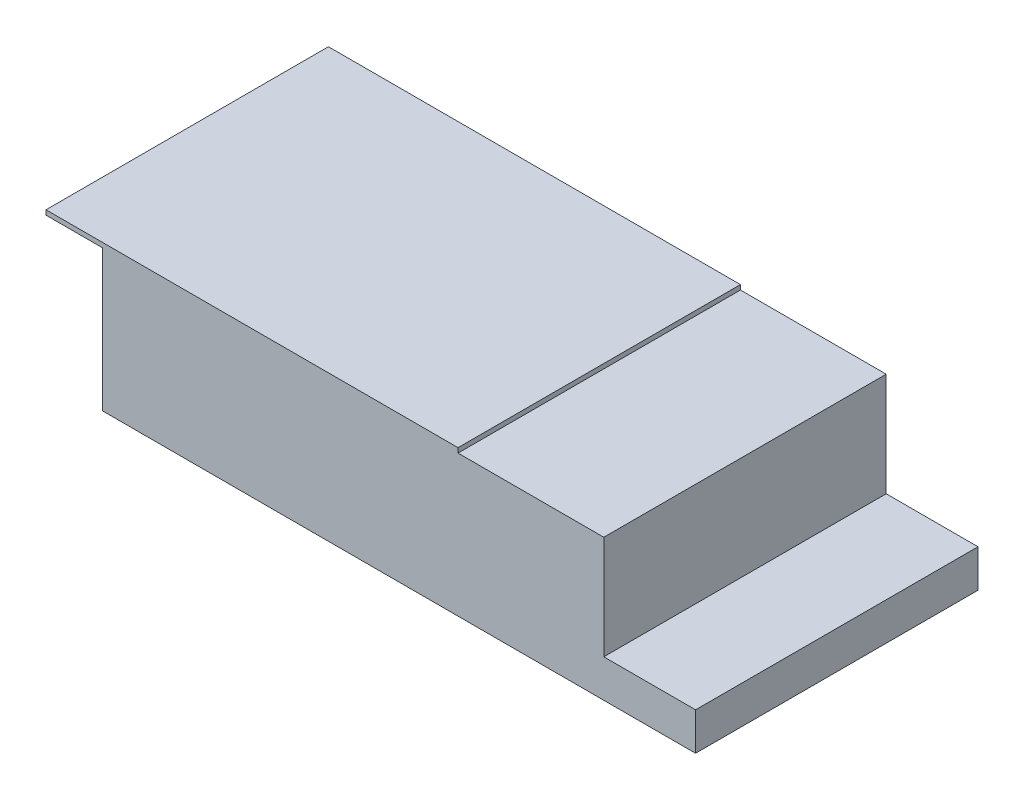
ISO-10303-21;
HEADER;
FILE_DESCRIPTION(('STEP AP214'),'2;1');
FILE_NAME('part.step','',(''),(''),'','','');
FILE_SCHEMA(('AUTOMOTIVE_DESIGN { 1 0 10303 214 1 1 1 1 }'));
ENDSEC;
DATA;
#1=APPLICATION_CONTEXT('core data for automotive mechanical design processes');
#2=APPLICATION_PROTOCOL_DEFINITION('international standard','automotive_design',2000,#1);
#3=PRODUCT_CONTEXT('',#1,'mechanical');
#4=PRODUCT('Part','Part','',(#3));
#5=PRODUCT_RELATED_PRODUCT_CATEGORY('part','',(#4));
#6=PRODUCT_DEFINITION_FORMATION('','',#4);
#7=PRODUCT_DEFINITION_CONTEXT('part definition',#1,'design');
#8=PRODUCT_DEFINITION('design','',#6,#7);
#9=PRODUCT_DEFINITION_SHAPE('','',#8);
#10=(LENGTH_UNIT() NAMED_UNIT(*) SI_UNIT(.MILLI.,.METRE.));
#11=(NAMED_UNIT(*) PLANE_ANGLE_UNIT() SI_UNIT($,.RADIAN.));
#12=(NAMED_UNIT(*) SI_UNIT($,.STERADIAN.) SOLID_ANGLE_UNIT());
#13=UNCERTAINTY_MEASURE_WITH_UNIT(LENGTH_MEASURE(1.E-05),#10,'distance_accuracy_value','');
#14=(GEOMETRIC_REPRESENTATION_CONTEXT(3) GLOBAL_UNCERTAINTY_ASSIGNED_CONTEXT((#13)) GLOBAL_UNIT_ASSIGNED_CONTEXT((#10,
#11,#12)) REPRESENTATION_CONTEXT('',''));
#15=CARTESIAN_POINT('',(0.,0.,0.));
#16=DIRECTION('',(0.,0.,1.));
#17=DIRECTION('',(1.,0.,0.));
#18=AXIS2_PLACEMENT_3D('',#15,#16,#17);
#19=CARTESIAN_POINT('',(0.,30.,0.));
#20=DIRECTION('',(0.,-1.,0.));
#21=DIRECTION('',(0.,0.,-1.));
#22=AXIS2_PLACEMENT_3D('',#19,#20,#21);
#23=PLANE('',#22);
#24=DIRECTION('',(0.,0.,-1.));
#25=VECTOR('',#24,1.);
#26=CARTESIAN_POINT('',(12.5332814769224,30.,-30.));
#27=LINE('',#26,#25);
#28=CARTESIAN_POINT('',(12.5332814769224,30.,29.9999999999999));
#29=VERTEX_POINT('',#28);
#30=CARTESIAN_POINT('',(12.5332814769224,30.,-30.));
#31=VERTEX_POINT('',#30);
#32=EDGE_CURVE('E61',#29,#31,#27,.T.);
#33=ORIENTED_EDGE('',*,*,#32,.F.);
#34=DIRECTION('',(1.,0.,0.));
#35=VECTOR('',#34,1.);
#36=CARTESIAN_POINT('',(-63.0000000000001,30.,29.9999999999999));
#37=LINE('',#36,#35);
#38=CARTESIAN_POINT('',(43.5,30.,29.9999999999999));
#39=VERTEX_POINT('',#38);
#40=EDGE_CURVE('E189',#29,#39,#37,.T.);
#41=ORIENTED_EDGE('',*,*,#40,.T.);
#42=DIRECTION('',(0.,0.,1.));
#43=VECTOR('',#42,1.);
#44=CARTESIAN_POINT('',(43.5,30.,-30.));
#45=LINE('',#44,#43);
#46=CARTESIAN_POINT('',(43.5,30.,-30.));
#47=VERTEX_POINT('',#46);
#48=EDGE_CURVE('E151',#47,#39,#45,.T.);
#49=ORIENTED_EDGE('',*,*,#48,.F.);
#50=DIRECTION('',(-1.,0.,0.));
#51=VECTOR('',#50,1.);
#52=CARTESIAN_POINT('',(-63.0000000000001,30.,-30.));
#53=LINE('',#52,#51);
#54=EDGE_CURVE('E181',#47,#31,#53,.T.);
#55=ORIENTED_EDGE('',*,*,#54,.T.);
#56=EDGE_LOOP('',(#33,#41,#49,#55));
#57=FACE_BOUND('',#56,.T.);
#58=ADVANCED_FACE('F45',(#57),#23,.F.);
#59=CARTESIAN_POINT('',(63.0000000000001,30.,29.9999999999999));
#60=DIRECTION('',(-1.,0.,0.));
#61=DIRECTION('',(0.,0.,1.));
#62=AXIS2_PLACEMENT_3D('',#59,#60,#61);
#63=PLANE('',#62);
#64=DIRECTION('',(0.,0.,-1.));
#65=VECTOR('',#64,1.);
#66=CARTESIAN_POINT('',(63.0000000000001,8.,29.9999999999999));
#67=LINE('',#66,#65);
#68=CARTESIAN_POINT('',(63.0000000000001,8.,29.9999999999999));
#69=VERTEX_POINT('',#68);
#70=CARTESIAN_POINT('',(63.0000000000001,8.,-30.));
#71=VERTEX_POINT('',#70);
#72=EDGE_CURVE('E171',#69,#71,#67,.T.);
#73=ORIENTED_EDGE('',*,*,#72,.F.);
#74=DIRECTION('',(0.,-1.,0.));
#75=VECTOR('',#74,1.);
#76=CARTESIAN_POINT('',(63.0000000000001,30.,29.9999999999999));
#77=LINE('',#76,#75);
#78=CARTESIAN_POINT('',(63.0000000000001,0.,29.9999999999999));
#79=VERTEX_POINT('',#78);
#80=EDGE_CURVE('E192',#69,#79,#77,.T.);
#81=ORIENTED_EDGE('',*,*,#80,.T.);
#82=DIRECTION('',(0.,0.,-1.));
#83=VECTOR('',#82,1.);
#84=CARTESIAN_POINT('',(63.0000000000001,0.,29.9999999999999));
#85=LINE('',#84,#83);
#86=CARTESIAN_POINT('',(63.0000000000001,0.,-30.));
#87=VERTEX_POINT('',#86);
#88=EDGE_CURVE('E178',#79,#87,#85,.T.);
#89=ORIENTED_EDGE('',*,*,#88,.T.);
#90=DIRECTION('',(0.,-1.,0.));
#91=VECTOR('',#90,1.);
#92=CARTESIAN_POINT('',(63.0000000000001,30.,-30.));
#93=LINE('',#92,#91);
#94=EDGE_CURVE('E11',#71,#87,#93,.T.);
#95=ORIENTED_EDGE('',*,*,#94,.F.);
#96=EDGE_LOOP('',(#73,#81,#89,#95));
#97=FACE_BOUND('',#96,.T.);
#98=ADVANCED_FACE('F47',(#97),#63,.F.);
#99=CARTESIAN_POINT('',(-63.0000000000001,30.,-30.));
#100=DIRECTION('',(0.,0.,1.));
#101=DIRECTION('',(1.,0.,0.));
#102=AXIS2_PLACEMENT_3D('',#99,#100,#101);
#103=PLANE('',#102);
#104=ORIENTED_EDGE('',*,*,#54,.F.);
#105=DIRECTION('',(0.,1.,0.));
#106=VECTOR('',#105,1.);
#107=CARTESIAN_POINT('',(43.5,8.,-30.));
#108=LINE('',#107,#106);
#109=CARTESIAN_POINT('',(43.5,8.,-30.));
#110=VERTEX_POINT('',#109);
#111=EDGE_CURVE('E69',#110,#47,#108,.T.);
#112=ORIENTED_EDGE('',*,*,#111,.F.);
#113=DIRECTION('',(-1.,0.,0.));
#114=VECTOR('',#113,1.);
#115=CARTESIAN_POINT('',(63.0000000000001,8.,-30.));
#116=LINE('',#115,#114);
#117=EDGE_CURVE('E155',#71,#110,#116,.T.);
#118=ORIENTED_EDGE('',*,*,#117,.F.);
#119=ORIENTED_EDGE('',*,*,#94,.T.);
#120=DIRECTION('',(-1.,0.,0.));
#121=VECTOR('',#120,1.);
#122=CARTESIAN_POINT('',(-63.0000000000001,0.,-30.));
#123=LINE('',#122,#121);
#124=CARTESIAN_POINT('',(-63.0000000000001,0.,-30.));
#125=VERTEX_POINT('',#124);
#126=EDGE_CURVE('E196',#87,#125,#123,.T.);
#127=ORIENTED_EDGE('',*,*,#126,.T.);
#128=DIRECTION('',(0.,-1.,0.));
#129=VECTOR('',#128,1.);
#130=CARTESIAN_POINT('',(-63.0000000000001,30.,-30.));
#131=LINE('',#130,#129);
#132=CARTESIAN_POINT('',(-63.0000000000001,30.,-30.));
#133=VERTEX_POINT('',#132);
#134=EDGE_CURVE('E54',#133,#125,#131,.T.);
#135=ORIENTED_EDGE('',*,*,#134,.F.);
#136=DIRECTION('',(-1.,0.,0.));
#137=VECTOR('',#136,1.);
#138=CARTESIAN_POINT('',(-75.0000000000001,30.,-30.));
#139=LINE('',#138,#137);
#140=CARTESIAN_POINT('',(-75.0000000000001,30.,-30.));
#141=VERTEX_POINT('',#140);
#142=EDGE_CURVE('E148',#133,#141,#139,.T.);
#143=ORIENTED_EDGE('',*,*,#142,.T.);
#144=DIRECTION('',(0.,-1.,0.));
#145=VECTOR('',#144,1.);
#146=CARTESIAN_POINT('',(-75.0000000000001,31.,-30.));
#147=LINE('',#146,#145);
#148=CARTESIAN_POINT('',(-75.0000000000001,31.,-30.));
#149=VERTEX_POINT('',#148);
#150=EDGE_CURVE('E127',#149,#141,#147,.T.);
#151=ORIENTED_EDGE('',*,*,#150,.F.);
#152=DIRECTION('',(-1.,0.,0.));
#153=VECTOR('',#152,1.);
#154=CARTESIAN_POINT('',(-75.0000000000001,31.,-30.));
#155=LINE('',#154,#153);
#156=CARTESIAN_POINT('',(12.5332814769224,31.,-30.));
#157=VERTEX_POINT('',#156);
#158=EDGE_CURVE('E134',#157,#149,#155,.T.);
#159=ORIENTED_EDGE('',*,*,#158,.F.);
#160=DIRECTION('',(0.,-1.,0.));
#161=VECTOR('',#160,1.);
#162=CARTESIAN_POINT('',(12.5332814769224,31.,-30.));
#163=LINE('',#162,#161);
#164=EDGE_CURVE('E242',#157,#31,#163,.T.);
#165=ORIENTED_EDGE('',*,*,#164,.T.);
#166=EDGE_LOOP('',(#104,#112,#118,#119,#127,#135,#143,#151,#159,#165));
#167=FACE_BOUND('',#166,.T.);
#168=ADVANCED_FACE('F146',(#167),#103,.F.);
#169=CARTESIAN_POINT('',(-63.0000000000001,30.,29.9999999999999));
#170=DIRECTION('',(1.,0.,0.));
#171=DIRECTION('',(0.,0.,-1.));
#172=AXIS2_PLACEMENT_3D('',#169,#170,#171);
#173=PLANE('',#172);
#174=DIRECTION('',(0.,0.,1.));
#175=VECTOR('',#174,1.);
#176=CARTESIAN_POINT('',(-63.0000000000001,0.,29.9999999999999));
#177=LINE('',#176,#175);
#178=CARTESIAN_POINT('',(-63.0000000000001,0.,29.9999999999999));
#179=VERTEX_POINT('',#178);
#180=EDGE_CURVE('E199',#125,#179,#177,.T.);
#181=ORIENTED_EDGE('',*,*,#180,.T.);
#182=DIRECTION('',(0.,-1.,0.));
#183=VECTOR('',#182,1.);
#184=CARTESIAN_POINT('',(-63.0000000000001,30.,29.9999999999999));
#185=LINE('',#184,#183);
#186=CARTESIAN_POINT('',(-63.0000000000001,30.,29.9999999999999));
#187=VERTEX_POINT('',#186);
#188=EDGE_CURVE('E207',#187,#179,#185,.T.);
#189=ORIENTED_EDGE('',*,*,#188,.F.);
#190=DIRECTION('',(0.,0.,1.));
#191=VECTOR('',#190,1.);
#192=CARTESIAN_POINT('',(-63.0000000000001,30.,29.9999999999999));
#193=LINE('',#192,#191);
#194=EDGE_CURVE('E184',#133,#187,#193,.T.);
#195=ORIENTED_EDGE('',*,*,#194,.F.);
#196=ORIENTED_EDGE('',*,*,#134,.T.);
#197=EDGE_LOOP('',(#181,#189,#195,#196));
#198=FACE_BOUND('',#197,.T.);
#199=ADVANCED_FACE('F215',(#198),#173,.F.);
#200=CARTESIAN_POINT('',(-63.0000000000001,30.,29.9999999999999));
#201=DIRECTION('',(0.,0.,-1.));
#202=DIRECTION('',(-1.,0.,0.));
#203=AXIS2_PLACEMENT_3D('',#200,#201,#202);
#204=PLANE('',#203);
#205=DIRECTION('',(1.,0.,0.));
#206=VECTOR('',#205,1.);
#207=CARTESIAN_POINT('',(43.5,8.,29.9999999999999));
#208=LINE('',#207,#206);
#209=CARTESIAN_POINT('',(43.5,8.,29.9999999999999));
#210=VERTEX_POINT('',#209);
#211=EDGE_CURVE('E168',#210,#69,#208,.T.);
#212=ORIENTED_EDGE('',*,*,#211,.F.);
#213=DIRECTION('',(0.,1.,0.));
#214=VECTOR('',#213,1.);
#215=CARTESIAN_POINT('',(43.5,8.,29.9999999999999));
#216=LINE('',#215,#214);
#217=EDGE_CURVE('E174',#210,#39,#216,.T.);
#218=ORIENTED_EDGE('',*,*,#217,.T.);
#219=ORIENTED_EDGE('',*,*,#40,.F.);
#220=DIRECTION('',(0.,-1.,0.));
#221=VECTOR('',#220,1.);
#222=CARTESIAN_POINT('',(12.5332814769224,31.,29.9999999999999));
#223=LINE('',#222,#221);
#224=CARTESIAN_POINT('',(12.5332814769224,31.,29.9999999999999));
#225=VERTEX_POINT('',#224);
#226=EDGE_CURVE('E157',#225,#29,#223,.T.);
#227=ORIENTED_EDGE('',*,*,#226,.F.);
#228=DIRECTION('',(1.,0.,0.));
#229=VECTOR('',#228,1.);
#230=CARTESIAN_POINT('',(12.5332814769224,31.,29.9999999999999));
#231=LINE('',#230,#229);
#232=CARTESIAN_POINT('',(-75.0000000000001,31.,29.9999999999999));
#233=VERTEX_POINT('',#232);
#234=EDGE_CURVE('E133',#233,#225,#231,.T.);
#235=ORIENTED_EDGE('',*,*,#234,.F.);
#236=DIRECTION('',(0.,-1.,0.));
#237=VECTOR('',#236,1.);
#238=CARTESIAN_POINT('',(-75.0000000000001,31.,29.9999999999999));
#239=LINE('',#238,#237);
#240=CARTESIAN_POINT('',(-75.0000000000001,30.,29.9999999999999));
#241=VERTEX_POINT('',#240);
#242=EDGE_CURVE('E129',#233,#241,#239,.T.);
#243=ORIENTED_EDGE('',*,*,#242,.T.);
#244=DIRECTION('',(1.,0.,0.));
#245=VECTOR('',#244,1.);
#246=CARTESIAN_POINT('',(12.5332814769224,30.,29.9999999999999));
#247=LINE('',#246,#245);
#248=EDGE_CURVE('E227',#241,#187,#247,.T.);
#249=ORIENTED_EDGE('',*,*,#248,.T.);
#250=ORIENTED_EDGE('',*,*,#188,.T.);
#251=DIRECTION('',(1.,0.,0.));
#252=VECTOR('',#251,1.);
#253=CARTESIAN_POINT('',(-63.0000000000001,0.,29.9999999999999));
#254=LINE('',#253,#252);
#255=EDGE_CURVE('E185',#179,#79,#254,.T.);
#256=ORIENTED_EDGE('',*,*,#255,.T.);
#257=ORIENTED_EDGE('',*,*,#80,.F.);
#258=EDGE_LOOP('',(#212,#218,#219,#227,#235,#243,#249,#250,#256,#257));
#259=FACE_BOUND('',#258,.T.);
#260=ADVANCED_FACE('F224',(#259),#204,.F.);
#261=CARTESIAN_POINT('',(0.,0.,0.));
#262=DIRECTION('',(0.,-1.,0.));
#263=DIRECTION('',(0.,0.,-1.));
#264=AXIS2_PLACEMENT_3D('',#261,#262,#263);
#265=PLANE('',#264);
#266=ORIENTED_EDGE('',*,*,#88,.F.);
#267=ORIENTED_EDGE('',*,*,#255,.F.);
#268=ORIENTED_EDGE('',*,*,#180,.F.);
#269=ORIENTED_EDGE('',*,*,#126,.F.);
#270=EDGE_LOOP('',(#266,#267,#268,#269));
#271=FACE_BOUND('',#270,.T.);
#272=ADVANCED_FACE('F220',(#271),#265,.T.);
#273=CARTESIAN_POINT('',(43.5,8.,-30.));
#274=DIRECTION('',(-1.,0.,0.));
#275=DIRECTION('',(0.,0.,1.));
#276=AXIS2_PLACEMENT_3D('',#273,#274,#275);
#277=PLANE('',#276);
#278=ORIENTED_EDGE('',*,*,#48,.T.);
#279=ORIENTED_EDGE('',*,*,#217,.F.);
#280=DIRECTION('',(0.,0.,1.));
#281=VECTOR('',#280,1.);
#282=CARTESIAN_POINT('',(43.5,8.,-30.));
#283=LINE('',#282,#281);
#284=EDGE_CURVE('E164',#110,#210,#283,.T.);
#285=ORIENTED_EDGE('',*,*,#284,.F.);
#286=ORIENTED_EDGE('',*,*,#111,.T.);
#287=EDGE_LOOP('',(#278,#279,#285,#286));
#288=FACE_BOUND('',#287,.T.);
#289=ADVANCED_FACE('F249',(#288),#277,.F.);
#290=CARTESIAN_POINT('',(0.,8.,0.));
#291=DIRECTION('',(0.,1.,0.));
#292=DIRECTION('',(0.,0.,1.));
#293=AXIS2_PLACEMENT_3D('',#290,#291,#292);
#294=PLANE('',#293);
#295=ORIENTED_EDGE('',*,*,#117,.T.);
#296=ORIENTED_EDGE('',*,*,#284,.T.);
#297=ORIENTED_EDGE('',*,*,#211,.T.);
#298=ORIENTED_EDGE('',*,*,#72,.T.);
#299=EDGE_LOOP('',(#295,#296,#297,#298));
#300=FACE_BOUND('',#299,.T.);
#301=ADVANCED_FACE('F251',(#300),#294,.T.);
#302=CARTESIAN_POINT('',(-75.0000000000001,31.,29.9999999999999));
#303=DIRECTION('',(1.,0.,0.));
#304=DIRECTION('',(0.,0.,-1.));
#305=AXIS2_PLACEMENT_3D('',#302,#303,#304);
#306=PLANE('',#305);
#307=DIRECTION('',(0.,0.,1.));
#308=VECTOR('',#307,1.);
#309=CARTESIAN_POINT('',(-75.0000000000001,30.,29.9999999999999));
#310=LINE('',#309,#308);
#311=EDGE_CURVE('E230',#141,#241,#310,.T.);
#312=ORIENTED_EDGE('',*,*,#311,.T.);
#313=ORIENTED_EDGE('',*,*,#242,.F.);
#314=DIRECTION('',(0.,0.,1.));
#315=VECTOR('',#314,1.);
#316=CARTESIAN_POINT('',(-75.0000000000001,31.,29.9999999999999));
#317=LINE('',#316,#315);
#318=EDGE_CURVE('E123',#149,#233,#317,.T.);
#319=ORIENTED_EDGE('',*,*,#318,.F.);
#320=ORIENTED_EDGE('',*,*,#150,.T.);
#321=EDGE_LOOP('',(#312,#313,#319,#320));
#322=FACE_BOUND('',#321,.T.);
#323=ADVANCED_FACE('F125',(#322),#306,.F.);
#324=CARTESIAN_POINT('',(12.5332814769224,31.,-30.));
#325=DIRECTION('',(-1.,0.,0.));
#326=DIRECTION('',(0.,0.,1.));
#327=AXIS2_PLACEMENT_3D('',#324,#325,#326);
#328=PLANE('',#327);
#329=ORIENTED_EDGE('',*,*,#32,.T.);
#330=ORIENTED_EDGE('',*,*,#164,.F.);
#331=DIRECTION('',(0.,0.,-1.));
#332=VECTOR('',#331,1.);
#333=CARTESIAN_POINT('',(12.5332814769224,31.,-30.));
#334=LINE('',#333,#332);
#335=EDGE_CURVE('E139',#225,#157,#334,.T.);
#336=ORIENTED_EDGE('',*,*,#335,.F.);
#337=ORIENTED_EDGE('',*,*,#226,.T.);
#338=EDGE_LOOP('',(#329,#330,#336,#337));
#339=FACE_BOUND('',#338,.T.);
#340=ADVANCED_FACE('F248',(#339),#328,.F.);
#341=CARTESIAN_POINT('',(0.,31.,0.));
#342=DIRECTION('',(0.,-1.,0.));
#343=DIRECTION('',(0.,0.,-1.));
#344=AXIS2_PLACEMENT_3D('',#341,#342,#343);
#345=PLANE('',#344);
#346=ORIENTED_EDGE('',*,*,#158,.T.);
#347=ORIENTED_EDGE('',*,*,#318,.T.);
#348=ORIENTED_EDGE('',*,*,#234,.T.);
#349=ORIENTED_EDGE('',*,*,#335,.T.);
#350=EDGE_LOOP('',(#346,#347,#348,#349));
#351=FACE_BOUND('',#350,.T.);
#352=ADVANCED_FACE('F137',(#351),#345,.F.);
#353=CARTESIAN_POINT('',(0.,30.,0.));
#354=DIRECTION('',(0.,-1.,0.));
#355=DIRECTION('',(0.,0.,-1.));
#356=AXIS2_PLACEMENT_3D('',#353,#354,#355);
#357=PLANE('',#356);
#358=ORIENTED_EDGE('',*,*,#142,.F.);
#359=ORIENTED_EDGE('',*,*,#194,.T.);
#360=ORIENTED_EDGE('',*,*,#248,.F.);
#361=ORIENTED_EDGE('',*,*,#311,.F.);
#362=EDGE_LOOP('',(#358,#359,#360,#361));
#363=FACE_BOUND('',#362,.T.);
#364=ADVANCED_FACE('F229',(#363),#357,.T.);
#365=CLOSED_SHELL('',(#58,#98,#168,#199,#260,#272,#289,#301,#323,#340,#352,#364));
#366=MANIFOLD_SOLID_BREP('B2',#365);
#367=ADVANCED_BREP_SHAPE_REPRESENTATION('',(#18,#366),#14);
#368=SHAPE_DEFINITION_REPRESENTATION(#9,#367);
ENDSEC;
END-ISO-10303-21;
